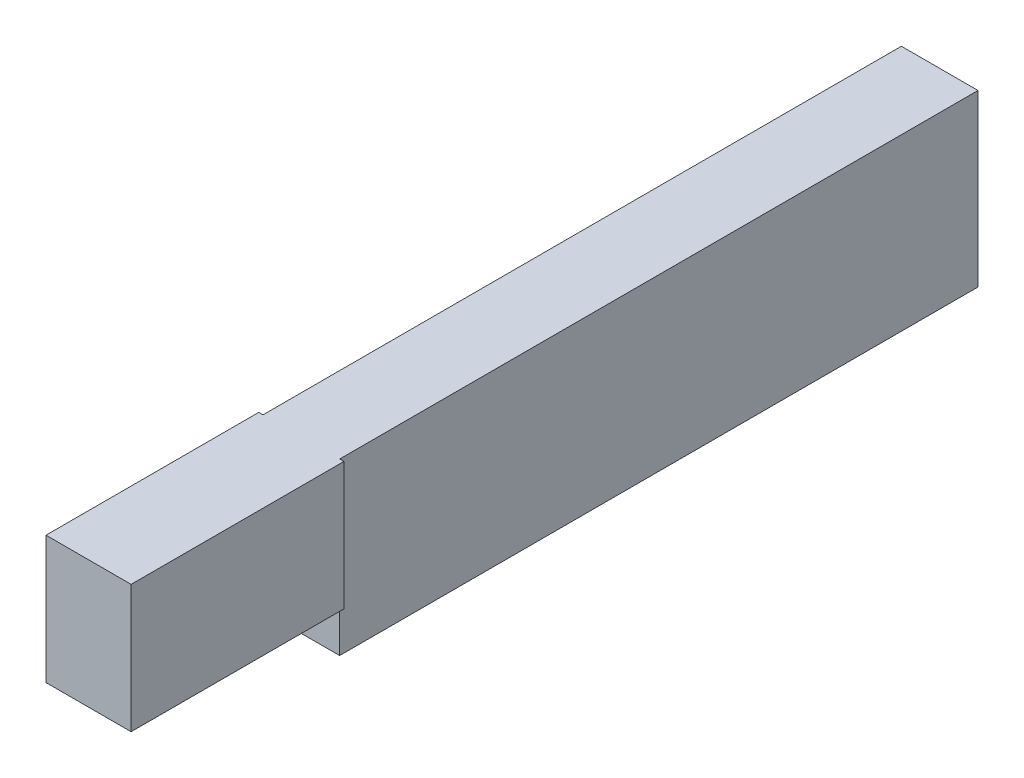
ISO-10303-21;
HEADER;
FILE_DESCRIPTION(('STEP AP214'),'2;1');
FILE_NAME('part.step','',(''),(''),'','','');
FILE_SCHEMA(('AUTOMOTIVE_DESIGN { 1 0 10303 214 1 1 1 1 }'));
ENDSEC;
DATA;
#1=APPLICATION_CONTEXT('core data for automotive mechanical design processes');
#2=APPLICATION_PROTOCOL_DEFINITION('international standard','automotive_design',2000,#1);
#3=PRODUCT_CONTEXT('',#1,'mechanical');
#4=PRODUCT('Part','Part','',(#3));
#5=PRODUCT_RELATED_PRODUCT_CATEGORY('part','',(#4));
#6=PRODUCT_DEFINITION_FORMATION('','',#4);
#7=PRODUCT_DEFINITION_CONTEXT('part definition',#1,'design');
#8=PRODUCT_DEFINITION('design','',#6,#7);
#9=PRODUCT_DEFINITION_SHAPE('','',#8);
#10=(LENGTH_UNIT() NAMED_UNIT(*) SI_UNIT(.MILLI.,.METRE.));
#11=(NAMED_UNIT(*) PLANE_ANGLE_UNIT() SI_UNIT($,.RADIAN.));
#12=(NAMED_UNIT(*) SI_UNIT($,.STERADIAN.) SOLID_ANGLE_UNIT());
#13=UNCERTAINTY_MEASURE_WITH_UNIT(LENGTH_MEASURE(1.E-05),#10,'distance_accuracy_value','');
#14=(GEOMETRIC_REPRESENTATION_CONTEXT(3) GLOBAL_UNCERTAINTY_ASSIGNED_CONTEXT((#13)) GLOBAL_UNIT_ASSIGNED_CONTEXT((#10,
#11,#12)) REPRESENTATION_CONTEXT('',''));
#15=CARTESIAN_POINT('',(0.,0.,0.));
#16=DIRECTION('',(0.,0.,1.));
#17=DIRECTION('',(1.,0.,0.));
#18=AXIS2_PLACEMENT_3D('',#15,#16,#17);
#19=CARTESIAN_POINT('',(0.,0.,37.5));
#20=DIRECTION('',(0.,0.,-1.));
#21=DIRECTION('',(-1.,0.,0.));
#22=AXIS2_PLACEMENT_3D('',#19,#20,#21);
#23=PLANE('',#22);
#24=DIRECTION('',(1.,0.,0.));
#25=VECTOR('',#24,1.);
#26=CARTESIAN_POINT('',(-2.5,-2.5,37.5));
#27=LINE('',#26,#25);
#28=CARTESIAN_POINT('',(2.25,-2.5,37.5));
#29=VERTEX_POINT('',#28);
#30=CARTESIAN_POINT('',(2.5,-2.5,37.5));
#31=VERTEX_POINT('',#30);
#32=EDGE_CURVE('E135',#29,#31,#27,.T.);
#33=ORIENTED_EDGE('',*,*,#32,.F.);
#34=DIRECTION('',(0.,1.,0.));
#35=VECTOR('',#34,1.);
#36=CARTESIAN_POINT('',(2.25,-5.,37.5));
#37=LINE('',#36,#35);
#38=CARTESIAN_POINT('',(2.25,5.,37.5));
#39=VERTEX_POINT('',#38);
#40=EDGE_CURVE('E11',#29,#39,#37,.T.);
#41=ORIENTED_EDGE('',*,*,#40,.T.);
#42=DIRECTION('',(-1.,0.,0.));
#43=VECTOR('',#42,1.);
#44=CARTESIAN_POINT('',(-2.5,5.,37.5));
#45=LINE('',#44,#43);
#46=CARTESIAN_POINT('',(2.5,5.,37.5));
#47=VERTEX_POINT('',#46);
#48=EDGE_CURVE('E134',#47,#39,#45,.T.);
#49=ORIENTED_EDGE('',*,*,#48,.F.);
#50=DIRECTION('',(0.,1.,0.));
#51=VECTOR('',#50,1.);
#52=CARTESIAN_POINT('',(2.5,5.,37.5));
#53=LINE('',#52,#51);
#54=EDGE_CURVE('E144',#31,#47,#53,.T.);
#55=ORIENTED_EDGE('',*,*,#54,.F.);
#56=EDGE_LOOP('',(#33,#41,#49,#55));
#57=FACE_BOUND('',#56,.T.);
#58=ADVANCED_FACE('F36',(#57),#23,.T.);
#59=CARTESIAN_POINT('',(-2.25,5.,37.5));
#60=VERTEX_POINT('',#59);
#61=CARTESIAN_POINT('',(-2.5,5.,37.5));
#62=VERTEX_POINT('',#61);
#63=EDGE_CURVE('E83',#60,#62,#45,.T.);
#64=ORIENTED_EDGE('',*,*,#63,.F.);
#65=DIRECTION('',(0.,-1.,0.));
#66=VECTOR('',#65,1.);
#67=CARTESIAN_POINT('',(-2.25,-5.,37.5));
#68=LINE('',#67,#66);
#69=CARTESIAN_POINT('',(-2.25,-2.5,37.5));
#70=VERTEX_POINT('',#69);
#71=EDGE_CURVE('E170',#60,#70,#68,.T.);
#72=ORIENTED_EDGE('',*,*,#71,.T.);
#73=CARTESIAN_POINT('',(-2.5,-2.5,37.5));
#74=VERTEX_POINT('',#73);
#75=EDGE_CURVE('E158',#74,#70,#27,.T.);
#76=ORIENTED_EDGE('',*,*,#75,.F.);
#77=DIRECTION('',(0.,-1.,0.));
#78=VECTOR('',#77,1.);
#79=CARTESIAN_POINT('',(-2.5,-2.5,37.5));
#80=LINE('',#79,#78);
#81=EDGE_CURVE('E127',#62,#74,#80,.T.);
#82=ORIENTED_EDGE('',*,*,#81,.F.);
#83=EDGE_LOOP('',(#64,#72,#76,#82));
#84=FACE_BOUND('',#83,.T.);
#85=ADVANCED_FACE('F171',(#84),#23,.T.);
#86=CARTESIAN_POINT('',(-2.5,-2.5,50.));
#87=DIRECTION('',(1.,0.,0.));
#88=DIRECTION('',(0.,1.,0.));
#89=AXIS2_PLACEMENT_3D('',#86,#87,#88);
#90=PLANE('',#89);
#91=ORIENTED_EDGE('',*,*,#81,.T.);
#92=DIRECTION('',(0.,0.,-1.));
#93=VECTOR('',#92,1.);
#94=CARTESIAN_POINT('',(-2.5,-2.5,50.));
#95=LINE('',#94,#93);
#96=CARTESIAN_POINT('',(-2.5,-2.5,50.));
#97=VERTEX_POINT('',#96);
#98=EDGE_CURVE('E40',#97,#74,#95,.T.);
#99=ORIENTED_EDGE('',*,*,#98,.F.);
#100=DIRECTION('',(0.,-1.,0.));
#101=VECTOR('',#100,1.);
#102=CARTESIAN_POINT('',(-2.5,-2.5,50.));
#103=LINE('',#102,#101);
#104=CARTESIAN_POINT('',(-2.5,5.,50.));
#105=VERTEX_POINT('',#104);
#106=EDGE_CURVE('E141',#105,#97,#103,.T.);
#107=ORIENTED_EDGE('',*,*,#106,.F.);
#108=DIRECTION('',(0.,0.,-1.));
#109=VECTOR('',#108,1.);
#110=CARTESIAN_POINT('',(-2.5,5.,50.));
#111=LINE('',#110,#109);
#112=EDGE_CURVE('E148',#105,#62,#111,.T.);
#113=ORIENTED_EDGE('',*,*,#112,.T.);
#114=EDGE_LOOP('',(#91,#99,#107,#113));
#115=FACE_BOUND('',#114,.T.);
#116=ADVANCED_FACE('F38',(#115),#90,.F.);
#117=CARTESIAN_POINT('',(-2.5,-2.5,50.));
#118=DIRECTION('',(0.,1.,0.));
#119=DIRECTION('',(0.,0.,1.));
#120=AXIS2_PLACEMENT_3D('',#117,#118,#119);
#121=PLANE('',#120);
#122=ORIENTED_EDGE('',*,*,#75,.T.);
#123=EDGE_CURVE('E164',#70,#29,#27,.T.);
#124=ORIENTED_EDGE('',*,*,#123,.T.);
#125=ORIENTED_EDGE('',*,*,#32,.T.);
#126=DIRECTION('',(0.,0.,-1.));
#127=VECTOR('',#126,1.);
#128=CARTESIAN_POINT('',(2.5,-2.5,50.));
#129=LINE('',#128,#127);
#130=CARTESIAN_POINT('',(2.5,-2.5,50.));
#131=VERTEX_POINT('',#130);
#132=EDGE_CURVE('E150',#131,#31,#129,.T.);
#133=ORIENTED_EDGE('',*,*,#132,.F.);
#134=DIRECTION('',(1.,0.,0.));
#135=VECTOR('',#134,1.);
#136=CARTESIAN_POINT('',(-2.5,-2.5,50.));
#137=LINE('',#136,#135);
#138=EDGE_CURVE('E91',#97,#131,#137,.T.);
#139=ORIENTED_EDGE('',*,*,#138,.F.);
#140=ORIENTED_EDGE('',*,*,#98,.T.);
#141=EDGE_LOOP('',(#122,#124,#125,#133,#139,#140));
#142=FACE_BOUND('',#141,.T.);
#143=ADVANCED_FACE('F157',(#142),#121,.F.);
#144=CARTESIAN_POINT('',(2.5,5.,50.));
#145=DIRECTION('',(-1.,0.,0.));
#146=DIRECTION('',(0.,0.,1.));
#147=AXIS2_PLACEMENT_3D('',#144,#145,#146);
#148=PLANE('',#147);
#149=ORIENTED_EDGE('',*,*,#54,.T.);
#150=DIRECTION('',(0.,0.,-1.));
#151=VECTOR('',#150,1.);
#152=CARTESIAN_POINT('',(2.5,5.,50.));
#153=LINE('',#152,#151);
#154=CARTESIAN_POINT('',(2.5,5.,50.));
#155=VERTEX_POINT('',#154);
#156=EDGE_CURVE('E140',#155,#47,#153,.T.);
#157=ORIENTED_EDGE('',*,*,#156,.F.);
#158=DIRECTION('',(0.,1.,0.));
#159=VECTOR('',#158,1.);
#160=CARTESIAN_POINT('',(2.5,5.,50.));
#161=LINE('',#160,#159);
#162=EDGE_CURVE('E190',#131,#155,#161,.T.);
#163=ORIENTED_EDGE('',*,*,#162,.F.);
#164=ORIENTED_EDGE('',*,*,#132,.T.);
#165=EDGE_LOOP('',(#149,#157,#163,#164));
#166=FACE_BOUND('',#165,.T.);
#167=ADVANCED_FACE('F192',(#166),#148,.F.);
#168=CARTESIAN_POINT('',(-2.5,5.,50.));
#169=DIRECTION('',(0.,-1.,0.));
#170=DIRECTION('',(0.,0.,-1.));
#171=AXIS2_PLACEMENT_3D('',#168,#169,#170);
#172=PLANE('',#171);
#173=ORIENTED_EDGE('',*,*,#48,.T.);
#174=DIRECTION('',(0.,0.,-1.));
#175=VECTOR('',#174,1.);
#176=CARTESIAN_POINT('',(2.25,5.,37.5));
#177=LINE('',#176,#175);
#178=CARTESIAN_POINT('',(2.25,5.,0.));
#179=VERTEX_POINT('',#178);
#180=EDGE_CURVE('E119',#39,#179,#177,.T.);
#181=ORIENTED_EDGE('',*,*,#180,.T.);
#182=DIRECTION('',(-1.,0.,0.));
#183=VECTOR('',#182,1.);
#184=CARTESIAN_POINT('',(-2.25,5.,0.));
#185=LINE('',#184,#183);
#186=CARTESIAN_POINT('',(-2.25,5.,0.));
#187=VERTEX_POINT('',#186);
#188=EDGE_CURVE('E179',#179,#187,#185,.T.);
#189=ORIENTED_EDGE('',*,*,#188,.T.);
#190=DIRECTION('',(0.,0.,-1.));
#191=VECTOR('',#190,1.);
#192=CARTESIAN_POINT('',(-2.25,5.,37.5));
#193=LINE('',#192,#191);
#194=EDGE_CURVE('E128',#60,#187,#193,.T.);
#195=ORIENTED_EDGE('',*,*,#194,.F.);
#196=ORIENTED_EDGE('',*,*,#63,.T.);
#197=ORIENTED_EDGE('',*,*,#112,.F.);
#198=DIRECTION('',(-1.,0.,0.));
#199=VECTOR('',#198,1.);
#200=CARTESIAN_POINT('',(-2.5,5.,50.));
#201=LINE('',#200,#199);
#202=EDGE_CURVE('E62',#155,#105,#201,.T.);
#203=ORIENTED_EDGE('',*,*,#202,.F.);
#204=ORIENTED_EDGE('',*,*,#156,.T.);
#205=EDGE_LOOP('',(#173,#181,#189,#195,#196,#197,#203,#204));
#206=FACE_BOUND('',#205,.T.);
#207=ADVANCED_FACE('F138',(#206),#172,.F.);
#208=CARTESIAN_POINT('',(0.,0.,50.));
#209=DIRECTION('',(0.,0.,-1.));
#210=DIRECTION('',(-1.,0.,0.));
#211=AXIS2_PLACEMENT_3D('',#208,#209,#210);
#212=PLANE('',#211);
#213=ORIENTED_EDGE('',*,*,#106,.T.);
#214=ORIENTED_EDGE('',*,*,#138,.T.);
#215=ORIENTED_EDGE('',*,*,#162,.T.);
#216=ORIENTED_EDGE('',*,*,#202,.T.);
#217=EDGE_LOOP('',(#213,#214,#215,#216));
#218=FACE_BOUND('',#217,.T.);
#219=ADVANCED_FACE('F191',(#218),#212,.F.);
#220=CARTESIAN_POINT('',(2.25,-5.,37.5));
#221=DIRECTION('',(-1.,0.,0.));
#222=DIRECTION('',(0.,0.,1.));
#223=AXIS2_PLACEMENT_3D('',#220,#221,#222);
#224=PLANE('',#223);
#225=DIRECTION('',(0.,1.,0.));
#226=VECTOR('',#225,1.);
#227=CARTESIAN_POINT('',(2.25,-5.,0.));
#228=LINE('',#227,#226);
#229=CARTESIAN_POINT('',(2.25,-5.,0.));
#230=VERTEX_POINT('',#229);
#231=EDGE_CURVE('E125',#230,#179,#228,.T.);
#232=ORIENTED_EDGE('',*,*,#231,.T.);
#233=ORIENTED_EDGE('',*,*,#180,.F.);
#234=ORIENTED_EDGE('',*,*,#40,.F.);
#235=CARTESIAN_POINT('',(2.25,-5.,37.5));
#236=VERTEX_POINT('',#235);
#237=EDGE_CURVE('E46',#236,#29,#37,.T.);
#238=ORIENTED_EDGE('',*,*,#237,.F.);
#239=DIRECTION('',(0.,0.,-1.));
#240=VECTOR('',#239,1.);
#241=CARTESIAN_POINT('',(2.25,-5.,37.5));
#242=LINE('',#241,#240);
#243=EDGE_CURVE('E175',#236,#230,#242,.T.);
#244=ORIENTED_EDGE('',*,*,#243,.T.);
#245=EDGE_LOOP('',(#232,#233,#234,#238,#244));
#246=FACE_BOUND('',#245,.T.);
#247=ADVANCED_FACE('F120',(#246),#224,.F.);
#248=CARTESIAN_POINT('',(-2.25,-5.,37.5));
#249=DIRECTION('',(1.,0.,0.));
#250=DIRECTION('',(0.,0.,-1.));
#251=AXIS2_PLACEMENT_3D('',#248,#249,#250);
#252=PLANE('',#251);
#253=DIRECTION('',(0.,-1.,0.));
#254=VECTOR('',#253,1.);
#255=CARTESIAN_POINT('',(-2.25,-5.,0.));
#256=LINE('',#255,#254);
#257=CARTESIAN_POINT('',(-2.25,-5.,0.));
#258=VERTEX_POINT('',#257);
#259=EDGE_CURVE('E181',#187,#258,#256,.T.);
#260=ORIENTED_EDGE('',*,*,#259,.T.);
#261=DIRECTION('',(0.,0.,-1.));
#262=VECTOR('',#261,1.);
#263=CARTESIAN_POINT('',(-2.25,-5.,37.5));
#264=LINE('',#263,#262);
#265=CARTESIAN_POINT('',(-2.25,-5.,37.5));
#266=VERTEX_POINT('',#265);
#267=EDGE_CURVE('E186',#266,#258,#264,.T.);
#268=ORIENTED_EDGE('',*,*,#267,.F.);
#269=EDGE_CURVE('E53',#70,#266,#68,.T.);
#270=ORIENTED_EDGE('',*,*,#269,.F.);
#271=ORIENTED_EDGE('',*,*,#71,.F.);
#272=ORIENTED_EDGE('',*,*,#194,.T.);
#273=EDGE_LOOP('',(#260,#268,#270,#271,#272));
#274=FACE_BOUND('',#273,.T.);
#275=ADVANCED_FACE('F210',(#274),#252,.F.);
#276=CARTESIAN_POINT('',(-2.25,-5.,37.5));
#277=DIRECTION('',(0.,1.,0.));
#278=DIRECTION('',(0.,0.,1.));
#279=AXIS2_PLACEMENT_3D('',#276,#277,#278);
#280=PLANE('',#279);
#281=DIRECTION('',(1.,0.,0.));
#282=VECTOR('',#281,1.);
#283=CARTESIAN_POINT('',(-2.25,-5.,0.));
#284=LINE('',#283,#282);
#285=EDGE_CURVE('E183',#258,#230,#284,.T.);
#286=ORIENTED_EDGE('',*,*,#285,.T.);
#287=ORIENTED_EDGE('',*,*,#243,.F.);
#288=DIRECTION('',(1.,0.,0.));
#289=VECTOR('',#288,1.);
#290=CARTESIAN_POINT('',(-2.25,-5.,37.5));
#291=LINE('',#290,#289);
#292=EDGE_CURVE('E173',#266,#236,#291,.T.);
#293=ORIENTED_EDGE('',*,*,#292,.F.);
#294=ORIENTED_EDGE('',*,*,#267,.T.);
#295=EDGE_LOOP('',(#286,#287,#293,#294));
#296=FACE_BOUND('',#295,.T.);
#297=ADVANCED_FACE('F213',(#296),#280,.F.);
#298=CARTESIAN_POINT('',(0.,0.,37.5));
#299=DIRECTION('',(0.,0.,-1.));
#300=DIRECTION('',(-1.,0.,0.));
#301=AXIS2_PLACEMENT_3D('',#298,#299,#300);
#302=PLANE('',#301);
#303=ORIENTED_EDGE('',*,*,#123,.F.);
#304=ORIENTED_EDGE('',*,*,#269,.T.);
#305=ORIENTED_EDGE('',*,*,#292,.T.);
#306=ORIENTED_EDGE('',*,*,#237,.T.);
#307=EDGE_LOOP('',(#303,#304,#305,#306));
#308=FACE_BOUND('',#307,.T.);
#309=ADVANCED_FACE('F169',(#308),#302,.F.);
#310=CARTESIAN_POINT('',(0.,0.,0.));
#311=DIRECTION('',(0.,0.,-1.));
#312=DIRECTION('',(-1.,0.,0.));
#313=AXIS2_PLACEMENT_3D('',#310,#311,#312);
#314=PLANE('',#313);
#315=ORIENTED_EDGE('',*,*,#231,.F.);
#316=ORIENTED_EDGE('',*,*,#285,.F.);
#317=ORIENTED_EDGE('',*,*,#259,.F.);
#318=ORIENTED_EDGE('',*,*,#188,.F.);
#319=EDGE_LOOP('',(#315,#316,#317,#318));
#320=FACE_BOUND('',#319,.T.);
#321=ADVANCED_FACE('F217',(#320),#314,.T.);
#322=CLOSED_SHELL('',(#58,#85,#116,#143,#167,#207,#219,#247,#275,#297,#309,#321));
#323=MANIFOLD_SOLID_BREP('B2',#322);
#324=ADVANCED_BREP_SHAPE_REPRESENTATION('',(#18,#323),#14);
#325=SHAPE_DEFINITION_REPRESENTATION(#9,#324);
ENDSEC;
END-ISO-10303-21;
